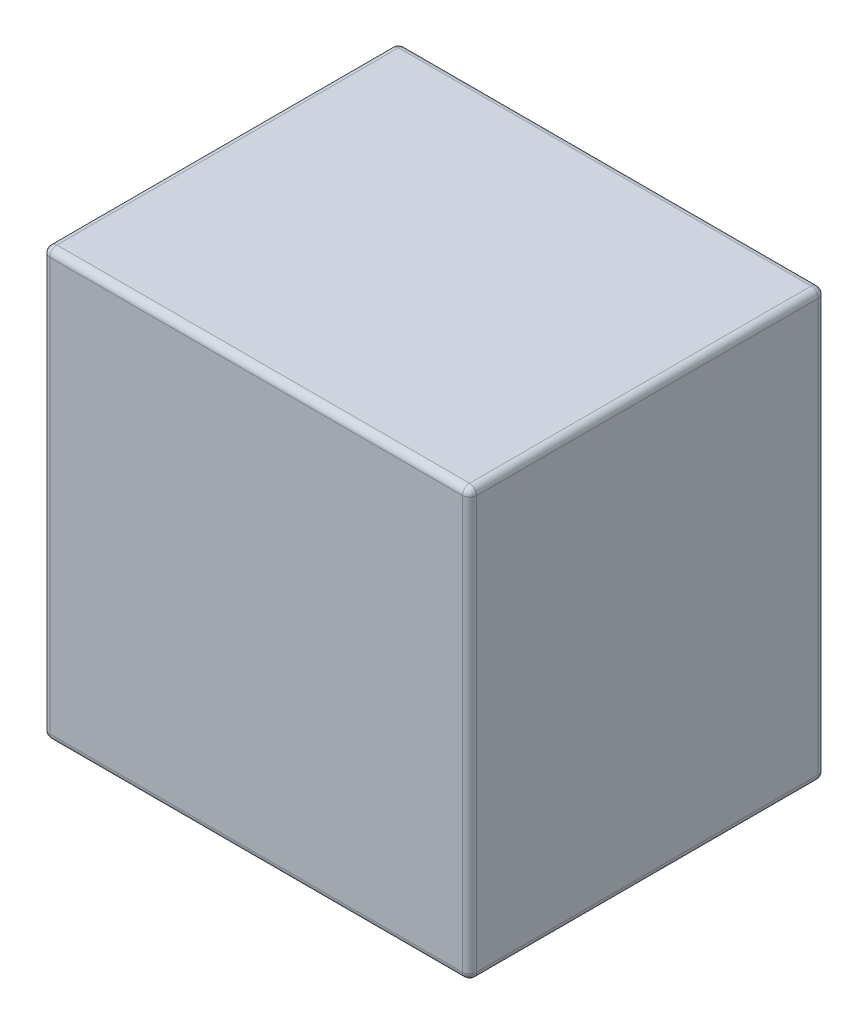
ISO-10303-21;
HEADER;
FILE_DESCRIPTION(('STEP AP214'),'2;1');
FILE_NAME('part.step','',(''),(''),'','','');
FILE_SCHEMA(('AUTOMOTIVE_DESIGN { 1 0 10303 214 1 1 1 1 }'));
ENDSEC;
DATA;
#1=APPLICATION_CONTEXT('core data for automotive mechanical design processes');
#2=APPLICATION_PROTOCOL_DEFINITION('international standard','automotive_design',2000,#1);
#3=PRODUCT_CONTEXT('',#1,'mechanical');
#4=PRODUCT('Part','Part','',(#3));
#5=PRODUCT_RELATED_PRODUCT_CATEGORY('part','',(#4));
#6=PRODUCT_DEFINITION_FORMATION('','',#4);
#7=PRODUCT_DEFINITION_CONTEXT('part definition',#1,'design');
#8=PRODUCT_DEFINITION('design','',#6,#7);
#9=PRODUCT_DEFINITION_SHAPE('','',#8);
#10=(LENGTH_UNIT() NAMED_UNIT(*) SI_UNIT(.MILLI.,.METRE.));
#11=(NAMED_UNIT(*) PLANE_ANGLE_UNIT() SI_UNIT($,.RADIAN.));
#12=(NAMED_UNIT(*) SI_UNIT($,.STERADIAN.) SOLID_ANGLE_UNIT());
#13=UNCERTAINTY_MEASURE_WITH_UNIT(LENGTH_MEASURE(1.E-05),#10,'distance_accuracy_value','');
#14=(GEOMETRIC_REPRESENTATION_CONTEXT(3) GLOBAL_UNCERTAINTY_ASSIGNED_CONTEXT((#13)) GLOBAL_UNIT_ASSIGNED_CONTEXT((#10,
#11,#12)) REPRESENTATION_CONTEXT('',''));
#15=CARTESIAN_POINT('',(0.,0.,0.));
#16=DIRECTION('',(0.,0.,1.));
#17=DIRECTION('',(1.,0.,0.));
#18=AXIS2_PLACEMENT_3D('',#15,#16,#17);
#19=CARTESIAN_POINT('',(3.,3.,5.));
#20=DIRECTION('',(0.,-1.,0.));
#21=DIRECTION('',(0.,0.,-1.));
#22=AXIS2_PLACEMENT_3D('',#19,#20,#21);
#23=PLANE('',#22);
#24=DIRECTION('',(0.,0.,-1.));
#25=VECTOR('',#24,1.);
#26=CARTESIAN_POINT('',(-2.9,3.,5.));
#27=LINE('',#26,#25);
#28=CARTESIAN_POINT('',(-2.9,3.,0.1));
#29=VERTEX_POINT('',#28);
#30=CARTESIAN_POINT('',(-2.9,3.,4.9));
#31=VERTEX_POINT('',#30);
#32=EDGE_CURVE('E138',#29,#31,#27,.F.);
#33=ORIENTED_EDGE('',*,*,#32,.T.);
#34=DIRECTION('',(-1.,0.,0.));
#35=VECTOR('',#34,1.);
#36=CARTESIAN_POINT('',(3.,3.,4.9));
#37=LINE('',#36,#35);
#38=CARTESIAN_POINT('',(2.9,3.,4.9));
#39=VERTEX_POINT('',#38);
#40=EDGE_CURVE('E175',#31,#39,#37,.F.);
#41=ORIENTED_EDGE('',*,*,#40,.T.);
#42=DIRECTION('',(0.,0.,-1.));
#43=VECTOR('',#42,1.);
#44=CARTESIAN_POINT('',(2.9,3.,5.));
#45=LINE('',#44,#43);
#46=CARTESIAN_POINT('',(2.9,3.,0.1));
#47=VERTEX_POINT('',#46);
#48=EDGE_CURVE('E172',#39,#47,#45,.T.);
#49=ORIENTED_EDGE('',*,*,#48,.T.);
#50=DIRECTION('',(-1.,0.,0.));
#51=VECTOR('',#50,1.);
#52=CARTESIAN_POINT('',(-3.,3.,0.1));
#53=LINE('',#52,#51);
#54=EDGE_CURVE('E167',#47,#29,#53,.T.);
#55=ORIENTED_EDGE('',*,*,#54,.T.);
#56=EDGE_LOOP('',(#33,#41,#49,#55));
#57=FACE_BOUND('',#56,.T.);
#58=ADVANCED_FACE('F43',(#57),#23,.F.);
#59=CARTESIAN_POINT('',(-3.,-3.,5.));
#60=DIRECTION('',(1.,0.,0.));
#61=DIRECTION('',(0.,0.,-1.));
#62=AXIS2_PLACEMENT_3D('',#59,#60,#61);
#63=PLANE('',#62);
#64=DIRECTION('',(0.,0.,-1.));
#65=VECTOR('',#64,1.);
#66=CARTESIAN_POINT('',(-3.,-2.9,5.));
#67=LINE('',#66,#65);
#68=CARTESIAN_POINT('',(-3.,-2.9,0.1));
#69=VERTEX_POINT('',#68);
#70=CARTESIAN_POINT('',(-3.,-2.9,4.9));
#71=VERTEX_POINT('',#70);
#72=EDGE_CURVE('E160',#69,#71,#67,.F.);
#73=ORIENTED_EDGE('',*,*,#72,.T.);
#74=DIRECTION('',(0.,-1.,0.));
#75=VECTOR('',#74,1.);
#76=CARTESIAN_POINT('',(-3.,-3.,4.9));
#77=LINE('',#76,#75);
#78=CARTESIAN_POINT('',(-3.,2.9,4.9));
#79=VERTEX_POINT('',#78);
#80=EDGE_CURVE('E164',#71,#79,#77,.F.);
#81=ORIENTED_EDGE('',*,*,#80,.T.);
#82=DIRECTION('',(0.,0.,-1.));
#83=VECTOR('',#82,1.);
#84=CARTESIAN_POINT('',(-3.,2.9,5.));
#85=LINE('',#84,#83);
#86=CARTESIAN_POINT('',(-3.,2.9,0.1));
#87=VERTEX_POINT('',#86);
#88=EDGE_CURVE('E136',#79,#87,#85,.T.);
#89=ORIENTED_EDGE('',*,*,#88,.T.);
#90=DIRECTION('',(0.,-1.,0.));
#91=VECTOR('',#90,1.);
#92=CARTESIAN_POINT('',(-3.,-3.,0.1));
#93=LINE('',#92,#91);
#94=EDGE_CURVE('E154',#87,#69,#93,.T.);
#95=ORIENTED_EDGE('',*,*,#94,.T.);
#96=EDGE_LOOP('',(#73,#81,#89,#95));
#97=FACE_BOUND('',#96,.T.);
#98=ADVANCED_FACE('F162',(#97),#63,.F.);
#99=CARTESIAN_POINT('',(3.,-3.,5.));
#100=DIRECTION('',(0.,1.,0.));
#101=DIRECTION('',(0.,0.,1.));
#102=AXIS2_PLACEMENT_3D('',#99,#100,#101);
#103=PLANE('',#102);
#104=DIRECTION('',(0.,0.,-1.));
#105=VECTOR('',#104,1.);
#106=CARTESIAN_POINT('',(2.9,-3.,5.));
#107=LINE('',#106,#105);
#108=CARTESIAN_POINT('',(2.9,-3.,0.1));
#109=VERTEX_POINT('',#108);
#110=CARTESIAN_POINT('',(2.9,-3.,4.9));
#111=VERTEX_POINT('',#110);
#112=EDGE_CURVE('E179',#109,#111,#107,.F.);
#113=ORIENTED_EDGE('',*,*,#112,.T.);
#114=DIRECTION('',(1.,0.,0.));
#115=VECTOR('',#114,1.);
#116=CARTESIAN_POINT('',(3.,-3.,4.9));
#117=LINE('',#116,#115);
#118=CARTESIAN_POINT('',(-2.9,-3.,4.9));
#119=VERTEX_POINT('',#118);
#120=EDGE_CURVE('E184',#111,#119,#117,.F.);
#121=ORIENTED_EDGE('',*,*,#120,.T.);
#122=DIRECTION('',(0.,0.,-1.));
#123=VECTOR('',#122,1.);
#124=CARTESIAN_POINT('',(-2.9,-3.,5.));
#125=LINE('',#124,#123);
#126=CARTESIAN_POINT('',(-2.9,-3.,0.1));
#127=VERTEX_POINT('',#126);
#128=EDGE_CURVE('E181',#119,#127,#125,.T.);
#129=ORIENTED_EDGE('',*,*,#128,.T.);
#130=DIRECTION('',(1.,0.,0.));
#131=VECTOR('',#130,1.);
#132=CARTESIAN_POINT('',(3.,-3.,0.1));
#133=LINE('',#132,#131);
#134=EDGE_CURVE('E177',#127,#109,#133,.T.);
#135=ORIENTED_EDGE('',*,*,#134,.T.);
#136=EDGE_LOOP('',(#113,#121,#129,#135));
#137=FACE_BOUND('',#136,.T.);
#138=ADVANCED_FACE('F289',(#137),#103,.F.);
#139=CARTESIAN_POINT('',(3.,-3.,5.));
#140=DIRECTION('',(-1.,0.,0.));
#141=DIRECTION('',(0.,0.,1.));
#142=AXIS2_PLACEMENT_3D('',#139,#140,#141);
#143=PLANE('',#142);
#144=DIRECTION('',(0.,0.,-1.));
#145=VECTOR('',#144,1.);
#146=CARTESIAN_POINT('',(3.,2.9,5.));
#147=LINE('',#146,#145);
#148=CARTESIAN_POINT('',(3.,2.9,0.1));
#149=VERTEX_POINT('',#148);
#150=CARTESIAN_POINT('',(3.,2.9,4.9));
#151=VERTEX_POINT('',#150);
#152=EDGE_CURVE('E188',#149,#151,#147,.F.);
#153=ORIENTED_EDGE('',*,*,#152,.T.);
#154=DIRECTION('',(0.,1.,0.));
#155=VECTOR('',#154,1.);
#156=CARTESIAN_POINT('',(3.,-3.,4.9));
#157=LINE('',#156,#155);
#158=CARTESIAN_POINT('',(3.,-2.9,4.9));
#159=VERTEX_POINT('',#158);
#160=EDGE_CURVE('E193',#151,#159,#157,.F.);
#161=ORIENTED_EDGE('',*,*,#160,.T.);
#162=DIRECTION('',(0.,0.,-1.));
#163=VECTOR('',#162,1.);
#164=CARTESIAN_POINT('',(3.,-2.9,5.));
#165=LINE('',#164,#163);
#166=CARTESIAN_POINT('',(3.,-2.9,0.1));
#167=VERTEX_POINT('',#166);
#168=EDGE_CURVE('E190',#159,#167,#165,.T.);
#169=ORIENTED_EDGE('',*,*,#168,.T.);
#170=DIRECTION('',(0.,1.,0.));
#171=VECTOR('',#170,1.);
#172=CARTESIAN_POINT('',(3.,3.,0.1));
#173=LINE('',#172,#171);
#174=EDGE_CURVE('E186',#167,#149,#173,.T.);
#175=ORIENTED_EDGE('',*,*,#174,.T.);
#176=EDGE_LOOP('',(#153,#161,#169,#175));
#177=FACE_BOUND('',#176,.T.);
#178=ADVANCED_FACE('F299',(#177),#143,.F.);
#179=CARTESIAN_POINT('',(0.,0.,5.));
#180=DIRECTION('',(0.,0.,-1.));
#181=DIRECTION('',(-1.,0.,0.));
#182=AXIS2_PLACEMENT_3D('',#179,#180,#181);
#183=PLANE('',#182);
#184=DIRECTION('',(1.,0.,0.));
#185=VECTOR('',#184,1.);
#186=CARTESIAN_POINT('',(0.,-2.9,5.));
#187=LINE('',#186,#185);
#188=CARTESIAN_POINT('',(-2.9,-2.9,5.));
#189=VERTEX_POINT('',#188);
#190=CARTESIAN_POINT('',(2.9,-2.9,5.));
#191=VERTEX_POINT('',#190);
#192=EDGE_CURVE('E199',#189,#191,#187,.T.);
#193=ORIENTED_EDGE('',*,*,#192,.T.);
#194=DIRECTION('',(0.,1.,0.));
#195=VECTOR('',#194,1.);
#196=CARTESIAN_POINT('',(2.9,0.,5.));
#197=LINE('',#196,#195);
#198=CARTESIAN_POINT('',(2.9,2.9,5.));
#199=VERTEX_POINT('',#198);
#200=EDGE_CURVE('E201',#191,#199,#197,.T.);
#201=ORIENTED_EDGE('',*,*,#200,.T.);
#202=DIRECTION('',(-1.,0.,0.));
#203=VECTOR('',#202,1.);
#204=CARTESIAN_POINT('',(0.,2.9,5.));
#205=LINE('',#204,#203);
#206=CARTESIAN_POINT('',(-2.9,2.9,5.));
#207=VERTEX_POINT('',#206);
#208=EDGE_CURVE('E195',#199,#207,#205,.T.);
#209=ORIENTED_EDGE('',*,*,#208,.T.);
#210=DIRECTION('',(0.,-1.,0.));
#211=VECTOR('',#210,1.);
#212=CARTESIAN_POINT('',(-2.9,0.,5.));
#213=LINE('',#212,#211);
#214=EDGE_CURVE('E197',#207,#189,#213,.T.);
#215=ORIENTED_EDGE('',*,*,#214,.T.);
#216=EDGE_LOOP('',(#193,#201,#209,#215));
#217=FACE_BOUND('',#216,.T.);
#218=ADVANCED_FACE('F281',(#217),#183,.F.);
#219=CARTESIAN_POINT('',(0.,0.,0.));
#220=DIRECTION('',(0.,0.,-1.));
#221=DIRECTION('',(-1.,0.,0.));
#222=AXIS2_PLACEMENT_3D('',#219,#220,#221);
#223=PLANE('',#222);
#224=DIRECTION('',(-1.,0.,0.));
#225=VECTOR('',#224,1.);
#226=CARTESIAN_POINT('',(3.,2.9,0.));
#227=LINE('',#226,#225);
#228=CARTESIAN_POINT('',(-2.9,2.9,0.));
#229=VERTEX_POINT('',#228);
#230=CARTESIAN_POINT('',(2.9,2.9,0.));
#231=VERTEX_POINT('',#230);
#232=EDGE_CURVE('E204',#229,#231,#227,.F.);
#233=ORIENTED_EDGE('',*,*,#232,.T.);
#234=DIRECTION('',(0.,1.,0.));
#235=VECTOR('',#234,1.);
#236=CARTESIAN_POINT('',(2.9,-3.,0.));
#237=LINE('',#236,#235);
#238=CARTESIAN_POINT('',(2.9,-2.9,0.));
#239=VERTEX_POINT('',#238);
#240=EDGE_CURVE('E11',#231,#239,#237,.F.);
#241=ORIENTED_EDGE('',*,*,#240,.T.);
#242=DIRECTION('',(1.,0.,0.));
#243=VECTOR('',#242,1.);
#244=CARTESIAN_POINT('',(-3.,-2.9,0.));
#245=LINE('',#244,#243);
#246=CARTESIAN_POINT('',(-2.9,-2.9,0.));
#247=VERTEX_POINT('',#246);
#248=EDGE_CURVE('E52',#239,#247,#245,.F.);
#249=ORIENTED_EDGE('',*,*,#248,.T.);
#250=DIRECTION('',(0.,-1.,0.));
#251=VECTOR('',#250,1.);
#252=CARTESIAN_POINT('',(-2.9,3.,0.));
#253=LINE('',#252,#251);
#254=EDGE_CURVE('E206',#247,#229,#253,.F.);
#255=ORIENTED_EDGE('',*,*,#254,.T.);
#256=EDGE_LOOP('',(#233,#241,#249,#255));
#257=FACE_BOUND('',#256,.T.);
#258=ADVANCED_FACE('F487',(#257),#223,.T.);
#259=CARTESIAN_POINT('',(2.9,-2.9,5.));
#260=DIRECTION('',(0.,0.,-1.));
#261=DIRECTION('',(-1.,0.,0.));
#262=AXIS2_PLACEMENT_3D('',#259,#260,#261);
#263=CYLINDRICAL_SURFACE('',#262,0.1);
#264=CARTESIAN_POINT('',(2.9,-2.9,4.9));
#265=DIRECTION('',(0.,0.,1.));
#266=DIRECTION('',(1.,0.,0.));
#267=AXIS2_PLACEMENT_3D('',#264,#265,#266);
#268=CIRCLE('',#267,0.1);
#269=EDGE_CURVE('E47',#111,#159,#268,.T.);
#270=ORIENTED_EDGE('',*,*,#269,.F.);
#271=ORIENTED_EDGE('',*,*,#112,.F.);
#272=CARTESIAN_POINT('',(2.9,-2.9,0.1));
#273=DIRECTION('',(0.,0.,-1.));
#274=DIRECTION('',(-1.,0.,0.));
#275=AXIS2_PLACEMENT_3D('',#272,#273,#274);
#276=CIRCLE('',#275,0.1);
#277=EDGE_CURVE('E259',#167,#109,#276,.T.);
#278=ORIENTED_EDGE('',*,*,#277,.F.);
#279=ORIENTED_EDGE('',*,*,#168,.F.);
#280=EDGE_LOOP('',(#270,#271,#278,#279));
#281=FACE_BOUND('',#280,.T.);
#282=ADVANCED_FACE('F45',(#281),#263,.T.);
#283=CARTESIAN_POINT('',(2.9,-2.9,4.9));
#284=DIRECTION('',(1.,0.,0.));
#285=DIRECTION('',(0.,0.,-1.));
#286=AXIS2_PLACEMENT_3D('',#283,#284,#285);
#287=SPHERICAL_SURFACE('',#286,0.1);
#288=CARTESIAN_POINT('',(2.9,-2.9,4.9));
#289=DIRECTION('',(1.,0.,0.));
#290=DIRECTION('',(0.,0.,-1.));
#291=AXIS2_PLACEMENT_3D('',#288,#289,#290);
#292=CIRCLE('',#291,0.1);
#293=EDGE_CURVE('E254',#111,#191,#292,.F.);
#294=ORIENTED_EDGE('',*,*,#293,.F.);
#295=ORIENTED_EDGE('',*,*,#269,.T.);
#296=CARTESIAN_POINT('',(2.9,-2.9,4.9));
#297=DIRECTION('',(0.,-1.,0.));
#298=DIRECTION('',(0.,0.,-1.));
#299=AXIS2_PLACEMENT_3D('',#296,#297,#298);
#300=CIRCLE('',#299,0.1);
#301=EDGE_CURVE('E257',#191,#159,#300,.F.);
#302=ORIENTED_EDGE('',*,*,#301,.F.);
#303=EDGE_LOOP('',(#294,#295,#302));
#304=FACE_BOUND('',#303,.T.);
#305=ADVANCED_FACE('F269',(#304),#287,.T.);
#306=CARTESIAN_POINT('',(2.9,-2.9,0.1));
#307=DIRECTION('',(0.,-1.,0.));
#308=DIRECTION('',(0.,0.,-1.));
#309=AXIS2_PLACEMENT_3D('',#306,#307,#308);
#310=SPHERICAL_SURFACE('',#309,0.1);
#311=CARTESIAN_POINT('',(2.9,-2.9,0.1));
#312=DIRECTION('',(0.,-1.,0.));
#313=DIRECTION('',(0.,0.,-1.));
#314=AXIS2_PLACEMENT_3D('',#311,#312,#313);
#315=CIRCLE('',#314,0.1);
#316=EDGE_CURVE('E249',#167,#239,#315,.F.);
#317=ORIENTED_EDGE('',*,*,#316,.F.);
#318=ORIENTED_EDGE('',*,*,#277,.T.);
#319=CARTESIAN_POINT('',(2.9,-2.9,0.1));
#320=DIRECTION('',(1.,0.,0.));
#321=DIRECTION('',(0.,0.,-1.));
#322=AXIS2_PLACEMENT_3D('',#319,#320,#321);
#323=CIRCLE('',#322,0.1);
#324=EDGE_CURVE('E252',#239,#109,#323,.F.);
#325=ORIENTED_EDGE('',*,*,#324,.F.);
#326=EDGE_LOOP('',(#317,#318,#325));
#327=FACE_BOUND('',#326,.T.);
#328=ADVANCED_FACE('F466',(#327),#310,.T.);
#329=CARTESIAN_POINT('',(2.9,0.,4.9));
#330=DIRECTION('',(0.,1.,0.));
#331=DIRECTION('',(0.,0.,1.));
#332=AXIS2_PLACEMENT_3D('',#329,#330,#331);
#333=CYLINDRICAL_SURFACE('',#332,0.1);
#334=ORIENTED_EDGE('',*,*,#301,.T.);
#335=ORIENTED_EDGE('',*,*,#160,.F.);
#336=CARTESIAN_POINT('',(2.9,2.9,4.9));
#337=DIRECTION('',(0.,1.,0.));
#338=DIRECTION('',(0.,0.,1.));
#339=AXIS2_PLACEMENT_3D('',#336,#337,#338);
#340=CIRCLE('',#339,0.1);
#341=EDGE_CURVE('E243',#199,#151,#340,.T.);
#342=ORIENTED_EDGE('',*,*,#341,.F.);
#343=ORIENTED_EDGE('',*,*,#200,.F.);
#344=EDGE_LOOP('',(#334,#335,#342,#343));
#345=FACE_BOUND('',#344,.T.);
#346=ADVANCED_FACE('F277',(#345),#333,.T.);
#347=CARTESIAN_POINT('',(0.,-2.9,4.9));
#348=DIRECTION('',(1.,0.,0.));
#349=DIRECTION('',(0.,0.,-1.));
#350=AXIS2_PLACEMENT_3D('',#347,#348,#349);
#351=CYLINDRICAL_SURFACE('',#350,0.1);
#352=ORIENTED_EDGE('',*,*,#293,.T.);
#353=ORIENTED_EDGE('',*,*,#192,.F.);
#354=CARTESIAN_POINT('',(-2.9,-2.9,4.9));
#355=DIRECTION('',(-1.,0.,0.));
#356=DIRECTION('',(0.,0.,1.));
#357=AXIS2_PLACEMENT_3D('',#354,#355,#356);
#358=CIRCLE('',#357,0.1);
#359=EDGE_CURVE('E240',#119,#189,#358,.T.);
#360=ORIENTED_EDGE('',*,*,#359,.F.);
#361=ORIENTED_EDGE('',*,*,#120,.F.);
#362=EDGE_LOOP('',(#352,#353,#360,#361));
#363=FACE_BOUND('',#362,.T.);
#364=ADVANCED_FACE('F286',(#363),#351,.T.);
#365=CARTESIAN_POINT('',(-2.9,-2.9,5.));
#366=DIRECTION('',(0.,0.,-1.));
#367=DIRECTION('',(-1.,0.,0.));
#368=AXIS2_PLACEMENT_3D('',#365,#366,#367);
#369=CYLINDRICAL_SURFACE('',#368,0.1);
#370=CARTESIAN_POINT('',(-2.9,-2.9,0.1));
#371=DIRECTION('',(0.,0.,-1.));
#372=DIRECTION('',(-1.,0.,0.));
#373=AXIS2_PLACEMENT_3D('',#370,#371,#372);
#374=CIRCLE('',#373,0.1);
#375=EDGE_CURVE('E234',#127,#69,#374,.T.);
#376=ORIENTED_EDGE('',*,*,#375,.F.);
#377=ORIENTED_EDGE('',*,*,#128,.F.);
#378=CARTESIAN_POINT('',(-2.9,-2.9,4.9));
#379=DIRECTION('',(0.,0.,1.));
#380=DIRECTION('',(1.,0.,0.));
#381=AXIS2_PLACEMENT_3D('',#378,#379,#380);
#382=CIRCLE('',#381,0.1);
#383=EDGE_CURVE('E237',#71,#119,#382,.T.);
#384=ORIENTED_EDGE('',*,*,#383,.F.);
#385=ORIENTED_EDGE('',*,*,#72,.F.);
#386=EDGE_LOOP('',(#376,#377,#384,#385));
#387=FACE_BOUND('',#386,.T.);
#388=ADVANCED_FACE('F293',(#387),#369,.T.);
#389=CARTESIAN_POINT('',(3.,-2.9,0.1));
#390=DIRECTION('',(-1.,0.,0.));
#391=DIRECTION('',(0.,0.,1.));
#392=AXIS2_PLACEMENT_3D('',#389,#390,#391);
#393=CYLINDRICAL_SURFACE('',#392,0.1);
#394=ORIENTED_EDGE('',*,*,#324,.T.);
#395=ORIENTED_EDGE('',*,*,#134,.F.);
#396=CARTESIAN_POINT('',(-2.9,-2.9,0.1));
#397=DIRECTION('',(-1.,0.,0.));
#398=DIRECTION('',(0.,-1.,0.));
#399=AXIS2_PLACEMENT_3D('',#396,#397,#398);
#400=CIRCLE('',#399,0.1);
#401=EDGE_CURVE('E232',#247,#127,#400,.T.);
#402=ORIENTED_EDGE('',*,*,#401,.F.);
#403=ORIENTED_EDGE('',*,*,#248,.F.);
#404=EDGE_LOOP('',(#394,#395,#402,#403));
#405=FACE_BOUND('',#404,.T.);
#406=ADVANCED_FACE('F297',(#405),#393,.T.);
#407=CARTESIAN_POINT('',(2.9,-3.,0.1));
#408=DIRECTION('',(0.,-1.,0.));
#409=DIRECTION('',(0.,0.,-1.));
#410=AXIS2_PLACEMENT_3D('',#407,#408,#409);
#411=CYLINDRICAL_SURFACE('',#410,0.1);
#412=ORIENTED_EDGE('',*,*,#316,.T.);
#413=ORIENTED_EDGE('',*,*,#240,.F.);
#414=CARTESIAN_POINT('',(2.9,2.9,0.1));
#415=DIRECTION('',(0.,1.,0.));
#416=DIRECTION('',(0.,0.,1.));
#417=AXIS2_PLACEMENT_3D('',#414,#415,#416);
#418=CIRCLE('',#417,0.1);
#419=EDGE_CURVE('E229',#149,#231,#418,.T.);
#420=ORIENTED_EDGE('',*,*,#419,.F.);
#421=ORIENTED_EDGE('',*,*,#174,.F.);
#422=EDGE_LOOP('',(#412,#413,#420,#421));
#423=FACE_BOUND('',#422,.T.);
#424=ADVANCED_FACE('F309',(#423),#411,.T.);
#425=CARTESIAN_POINT('',(2.9,2.9,5.));
#426=DIRECTION('',(0.,0.,-1.));
#427=DIRECTION('',(-1.,0.,0.));
#428=AXIS2_PLACEMENT_3D('',#425,#426,#427);
#429=CYLINDRICAL_SURFACE('',#428,0.1);
#430=CARTESIAN_POINT('',(2.9,2.9,4.9));
#431=DIRECTION('',(0.,0.,1.));
#432=DIRECTION('',(1.,0.,0.));
#433=AXIS2_PLACEMENT_3D('',#430,#431,#432);
#434=CIRCLE('',#433,0.1);
#435=EDGE_CURVE('E246',#151,#39,#434,.T.);
#436=ORIENTED_EDGE('',*,*,#435,.F.);
#437=ORIENTED_EDGE('',*,*,#152,.F.);
#438=CARTESIAN_POINT('',(2.9,2.9,0.1));
#439=DIRECTION('',(0.,0.,-1.));
#440=DIRECTION('',(-1.,0.,0.));
#441=AXIS2_PLACEMENT_3D('',#438,#439,#440);
#442=CIRCLE('',#441,0.1);
#443=EDGE_CURVE('E226',#47,#149,#442,.T.);
#444=ORIENTED_EDGE('',*,*,#443,.F.);
#445=ORIENTED_EDGE('',*,*,#48,.F.);
#446=EDGE_LOOP('',(#436,#437,#444,#445));
#447=FACE_BOUND('',#446,.T.);
#448=ADVANCED_FACE('F304',(#447),#429,.T.);
#449=CARTESIAN_POINT('',(2.9,2.9,4.9));
#450=DIRECTION('',(1.,0.,0.));
#451=DIRECTION('',(0.,0.,-1.));
#452=AXIS2_PLACEMENT_3D('',#449,#450,#451);
#453=SPHERICAL_SURFACE('',#452,0.1);
#454=ORIENTED_EDGE('',*,*,#341,.T.);
#455=ORIENTED_EDGE('',*,*,#435,.T.);
#456=CARTESIAN_POINT('',(2.9,2.9,4.9));
#457=DIRECTION('',(1.,0.,0.));
#458=DIRECTION('',(0.,0.,-1.));
#459=AXIS2_PLACEMENT_3D('',#456,#457,#458);
#460=CIRCLE('',#459,0.1);
#461=EDGE_CURVE('E223',#199,#39,#460,.F.);
#462=ORIENTED_EDGE('',*,*,#461,.F.);
#463=EDGE_LOOP('',(#454,#455,#462));
#464=FACE_BOUND('',#463,.T.);
#465=ADVANCED_FACE('F320',(#464),#453,.T.);
#466=CARTESIAN_POINT('',(-2.9,-2.9,4.9));
#467=DIRECTION('',(0.,-1.,0.));
#468=DIRECTION('',(1.,0.,0.));
#469=AXIS2_PLACEMENT_3D('',#466,#467,#468);
#470=SPHERICAL_SURFACE('',#469,0.1);
#471=ORIENTED_EDGE('',*,*,#383,.T.);
#472=ORIENTED_EDGE('',*,*,#359,.T.);
#473=CARTESIAN_POINT('',(-2.9,-2.9,4.9));
#474=DIRECTION('',(0.,-1.,0.));
#475=DIRECTION('',(0.,0.,-1.));
#476=AXIS2_PLACEMENT_3D('',#473,#474,#475);
#477=CIRCLE('',#476,0.1);
#478=EDGE_CURVE('E220',#71,#189,#477,.F.);
#479=ORIENTED_EDGE('',*,*,#478,.F.);
#480=EDGE_LOOP('',(#471,#472,#479));
#481=FACE_BOUND('',#480,.T.);
#482=ADVANCED_FACE('F330',(#481),#470,.T.);
#483=CARTESIAN_POINT('',(-2.9,-2.9,0.1));
#484=DIRECTION('',(0.,-1.,0.));
#485=DIRECTION('',(1.,0.,0.));
#486=AXIS2_PLACEMENT_3D('',#483,#484,#485);
#487=SPHERICAL_SURFACE('',#486,0.1);
#488=ORIENTED_EDGE('',*,*,#401,.T.);
#489=ORIENTED_EDGE('',*,*,#375,.T.);
#490=CARTESIAN_POINT('',(-2.9,-2.9,0.1));
#491=DIRECTION('',(0.,-1.,0.));
#492=DIRECTION('',(0.,0.,-1.));
#493=AXIS2_PLACEMENT_3D('',#490,#491,#492);
#494=CIRCLE('',#493,0.1);
#495=EDGE_CURVE('E157',#247,#69,#494,.F.);
#496=ORIENTED_EDGE('',*,*,#495,.F.);
#497=EDGE_LOOP('',(#488,#489,#496));
#498=FACE_BOUND('',#497,.T.);
#499=ADVANCED_FACE('F332',(#498),#487,.T.);
#500=CARTESIAN_POINT('',(2.9,2.9,0.1));
#501=DIRECTION('',(1.,0.,0.));
#502=DIRECTION('',(0.,0.,-1.));
#503=AXIS2_PLACEMENT_3D('',#500,#501,#502);
#504=SPHERICAL_SURFACE('',#503,0.1);
#505=ORIENTED_EDGE('',*,*,#443,.T.);
#506=ORIENTED_EDGE('',*,*,#419,.T.);
#507=CARTESIAN_POINT('',(2.9,2.9,0.1));
#508=DIRECTION('',(1.,0.,0.));
#509=DIRECTION('',(0.,0.,-1.));
#510=AXIS2_PLACEMENT_3D('',#507,#508,#509);
#511=CIRCLE('',#510,0.1);
#512=EDGE_CURVE('E216',#47,#231,#511,.F.);
#513=ORIENTED_EDGE('',*,*,#512,.F.);
#514=EDGE_LOOP('',(#505,#506,#513));
#515=FACE_BOUND('',#514,.T.);
#516=ADVANCED_FACE('F311',(#515),#504,.T.);
#517=CARTESIAN_POINT('',(0.,2.9,4.9));
#518=DIRECTION('',(-1.,0.,0.));
#519=DIRECTION('',(0.,0.,1.));
#520=AXIS2_PLACEMENT_3D('',#517,#518,#519);
#521=CYLINDRICAL_SURFACE('',#520,0.1);
#522=ORIENTED_EDGE('',*,*,#461,.T.);
#523=ORIENTED_EDGE('',*,*,#40,.F.);
#524=CARTESIAN_POINT('',(-2.9,2.9,4.9));
#525=DIRECTION('',(-1.,0.,0.));
#526=DIRECTION('',(0.,0.,1.));
#527=AXIS2_PLACEMENT_3D('',#524,#525,#526);
#528=CIRCLE('',#527,0.1);
#529=EDGE_CURVE('E213',#207,#31,#528,.T.);
#530=ORIENTED_EDGE('',*,*,#529,.F.);
#531=ORIENTED_EDGE('',*,*,#208,.F.);
#532=EDGE_LOOP('',(#522,#523,#530,#531));
#533=FACE_BOUND('',#532,.T.);
#534=ADVANCED_FACE('F322',(#533),#521,.T.);
#535=CARTESIAN_POINT('',(-2.9,0.,4.9));
#536=DIRECTION('',(0.,-1.,0.));
#537=DIRECTION('',(0.,0.,-1.));
#538=AXIS2_PLACEMENT_3D('',#535,#536,#537);
#539=CYLINDRICAL_SURFACE('',#538,0.1);
#540=ORIENTED_EDGE('',*,*,#478,.T.);
#541=ORIENTED_EDGE('',*,*,#214,.F.);
#542=CARTESIAN_POINT('',(-2.9,2.9,4.9));
#543=DIRECTION('',(0.,1.,0.));
#544=DIRECTION('',(0.,0.,1.));
#545=AXIS2_PLACEMENT_3D('',#542,#543,#544);
#546=CIRCLE('',#545,0.1);
#547=EDGE_CURVE('E151',#79,#207,#546,.T.);
#548=ORIENTED_EDGE('',*,*,#547,.F.);
#549=ORIENTED_EDGE('',*,*,#80,.F.);
#550=EDGE_LOOP('',(#540,#541,#548,#549));
#551=FACE_BOUND('',#550,.T.);
#552=ADVANCED_FACE('F328',(#551),#539,.T.);
#553=CARTESIAN_POINT('',(-2.9,-3.,0.1));
#554=DIRECTION('',(0.,1.,0.));
#555=DIRECTION('',(0.,0.,1.));
#556=AXIS2_PLACEMENT_3D('',#553,#554,#555);
#557=CYLINDRICAL_SURFACE('',#556,0.1);
#558=ORIENTED_EDGE('',*,*,#495,.T.);
#559=ORIENTED_EDGE('',*,*,#94,.F.);
#560=CARTESIAN_POINT('',(-2.9,2.9,0.1));
#561=DIRECTION('',(0.,1.,0.));
#562=DIRECTION('',(-1.,0.,0.));
#563=AXIS2_PLACEMENT_3D('',#560,#561,#562);
#564=CIRCLE('',#563,0.1);
#565=EDGE_CURVE('E144',#229,#87,#564,.T.);
#566=ORIENTED_EDGE('',*,*,#565,.F.);
#567=ORIENTED_EDGE('',*,*,#254,.F.);
#568=EDGE_LOOP('',(#558,#559,#566,#567));
#569=FACE_BOUND('',#568,.T.);
#570=ADVANCED_FACE('F155',(#569),#557,.T.);
#571=CARTESIAN_POINT('',(3.,2.9,0.1));
#572=DIRECTION('',(1.,0.,0.));
#573=DIRECTION('',(0.,0.,-1.));
#574=AXIS2_PLACEMENT_3D('',#571,#572,#573);
#575=CYLINDRICAL_SURFACE('',#574,0.1);
#576=ORIENTED_EDGE('',*,*,#512,.T.);
#577=ORIENTED_EDGE('',*,*,#232,.F.);
#578=CARTESIAN_POINT('',(-2.9,2.9,0.1));
#579=DIRECTION('',(-1.,0.,0.));
#580=DIRECTION('',(0.,0.,1.));
#581=AXIS2_PLACEMENT_3D('',#578,#579,#580);
#582=CIRCLE('',#581,0.1);
#583=EDGE_CURVE('E148',#29,#229,#582,.T.);
#584=ORIENTED_EDGE('',*,*,#583,.F.);
#585=ORIENTED_EDGE('',*,*,#54,.F.);
#586=EDGE_LOOP('',(#576,#577,#584,#585));
#587=FACE_BOUND('',#586,.T.);
#588=ADVANCED_FACE('F315',(#587),#575,.T.);
#589=CARTESIAN_POINT('',(-2.9,2.9,4.9));
#590=DIRECTION('',(0.,0.,1.));
#591=DIRECTION('',(1.,0.,0.));
#592=AXIS2_PLACEMENT_3D('',#589,#590,#591);
#593=SPHERICAL_SURFACE('',#592,0.1);
#594=ORIENTED_EDGE('',*,*,#547,.T.);
#595=ORIENTED_EDGE('',*,*,#529,.T.);
#596=CARTESIAN_POINT('',(-2.9,2.9,4.9));
#597=DIRECTION('',(0.,0.,1.));
#598=DIRECTION('',(1.,0.,0.));
#599=AXIS2_PLACEMENT_3D('',#596,#597,#598);
#600=CIRCLE('',#599,0.1);
#601=EDGE_CURVE('E141',#79,#31,#600,.F.);
#602=ORIENTED_EDGE('',*,*,#601,.F.);
#603=EDGE_LOOP('',(#594,#595,#602));
#604=FACE_BOUND('',#603,.T.);
#605=ADVANCED_FACE('F326',(#604),#593,.T.);
#606=CARTESIAN_POINT('',(-2.9,2.9,0.1));
#607=DIRECTION('',(0.,0.,-1.));
#608=DIRECTION('',(-1.,0.,0.));
#609=AXIS2_PLACEMENT_3D('',#606,#607,#608);
#610=SPHERICAL_SURFACE('',#609,0.1);
#611=ORIENTED_EDGE('',*,*,#583,.T.);
#612=ORIENTED_EDGE('',*,*,#565,.T.);
#613=CARTESIAN_POINT('',(-2.9,2.9,0.1));
#614=DIRECTION('',(0.,0.,-1.));
#615=DIRECTION('',(-1.,0.,0.));
#616=AXIS2_PLACEMENT_3D('',#613,#614,#615);
#617=CIRCLE('',#616,0.1);
#618=EDGE_CURVE('E132',#29,#87,#617,.F.);
#619=ORIENTED_EDGE('',*,*,#618,.F.);
#620=EDGE_LOOP('',(#611,#612,#619));
#621=FACE_BOUND('',#620,.T.);
#622=ADVANCED_FACE('F146',(#621),#610,.T.);
#623=CARTESIAN_POINT('',(-2.9,2.9,5.));
#624=DIRECTION('',(0.,0.,-1.));
#625=DIRECTION('',(-1.,0.,0.));
#626=AXIS2_PLACEMENT_3D('',#623,#624,#625);
#627=CYLINDRICAL_SURFACE('',#626,0.1);
#628=ORIENTED_EDGE('',*,*,#601,.T.);
#629=ORIENTED_EDGE('',*,*,#32,.F.);
#630=ORIENTED_EDGE('',*,*,#618,.T.);
#631=ORIENTED_EDGE('',*,*,#88,.F.);
#632=EDGE_LOOP('',(#628,#629,#630,#631));
#633=FACE_BOUND('',#632,.T.);
#634=ADVANCED_FACE('F134',(#633),#627,.T.);
#635=CLOSED_SHELL('',(#58,#98,#138,#178,#218,#258,#282,#305,#328,#346,#364,#388,#406,#424,#448,
#465,#482,#499,#516,#534,#552,#570,#588,#605,#622,#634));
#636=MANIFOLD_SOLID_BREP('B2',#635);
#637=ADVANCED_BREP_SHAPE_REPRESENTATION('',(#18,#636),#14);
#638=SHAPE_DEFINITION_REPRESENTATION(#9,#637);
ENDSEC;
END-ISO-10303-21;
